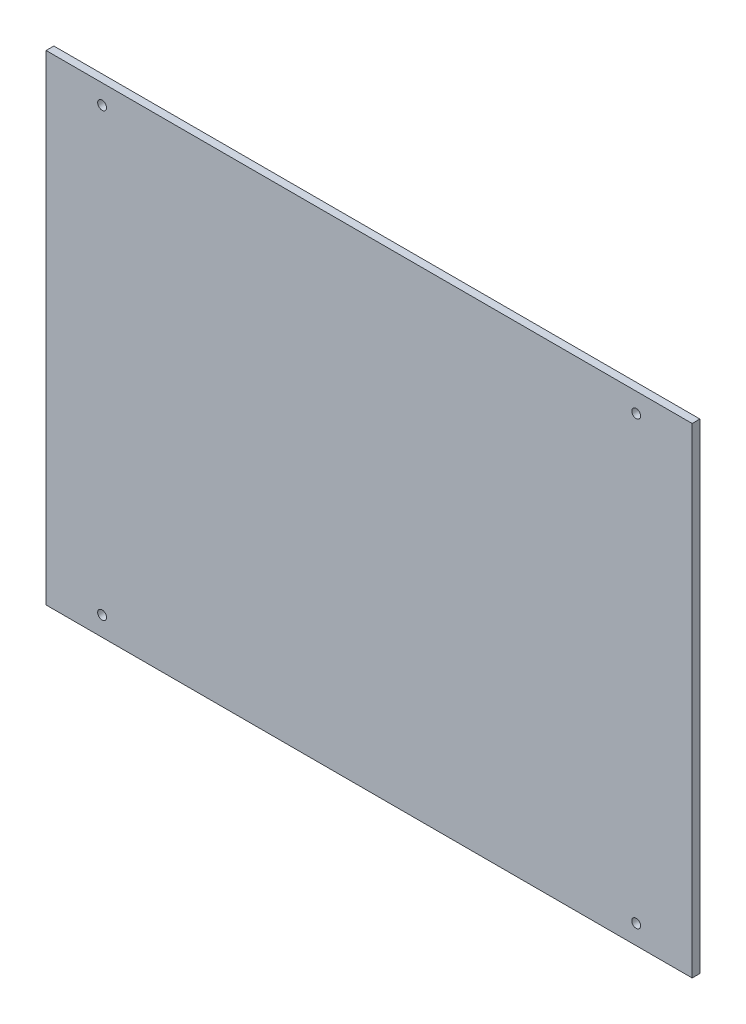
ISO-10303-21;
HEADER;
FILE_DESCRIPTION(('STEP AP214'),'2;1');
FILE_NAME('part.step','',(''),(''),'','','');
FILE_SCHEMA(('AUTOMOTIVE_DESIGN { 1 0 10303 214 1 1 1 1 }'));
ENDSEC;
DATA;
#1=APPLICATION_CONTEXT('core data for automotive mechanical design processes');
#2=APPLICATION_PROTOCOL_DEFINITION('international standard','automotive_design',2000,#1);
#3=PRODUCT_CONTEXT('',#1,'mechanical');
#4=PRODUCT('Part','Part','',(#3));
#5=PRODUCT_RELATED_PRODUCT_CATEGORY('part','',(#4));
#6=PRODUCT_DEFINITION_FORMATION('','',#4);
#7=PRODUCT_DEFINITION_CONTEXT('part definition',#1,'design');
#8=PRODUCT_DEFINITION('design','',#6,#7);
#9=PRODUCT_DEFINITION_SHAPE('','',#8);
#10=(LENGTH_UNIT() NAMED_UNIT(*) SI_UNIT(.MILLI.,.METRE.));
#11=(NAMED_UNIT(*) PLANE_ANGLE_UNIT() SI_UNIT($,.RADIAN.));
#12=(NAMED_UNIT(*) SI_UNIT($,.STERADIAN.) SOLID_ANGLE_UNIT());
#13=UNCERTAINTY_MEASURE_WITH_UNIT(LENGTH_MEASURE(1.E-05),#10,'distance_accuracy_value','');
#14=(GEOMETRIC_REPRESENTATION_CONTEXT(3) GLOBAL_UNCERTAINTY_ASSIGNED_CONTEXT((#13)) GLOBAL_UNIT_ASSIGNED_CONTEXT((#10,
#11,#12)) REPRESENTATION_CONTEXT('',''));
#15=CARTESIAN_POINT('',(0.,0.,0.));
#16=DIRECTION('',(0.,0.,1.));
#17=DIRECTION('',(1.,0.,0.));
#18=AXIS2_PLACEMENT_3D('',#15,#16,#17);
#19=CARTESIAN_POINT('',(-150.,-111.5,-3.6));
#20=DIRECTION('',(-1.,0.,0.));
#21=DIRECTION('',(0.,0.,1.));
#22=AXIS2_PLACEMENT_3D('',#19,#20,#21);
#23=PLANE('',#22);
#24=DIRECTION('',(0.,-1.,0.));
#25=VECTOR('',#24,1.);
#26=CARTESIAN_POINT('',(-150.,-111.5,0.));
#27=LINE('',#26,#25);
#28=CARTESIAN_POINT('',(-150.,111.5,0.));
#29=VERTEX_POINT('',#28);
#30=CARTESIAN_POINT('',(-150.,-111.5,0.));
#31=VERTEX_POINT('',#30);
#32=EDGE_CURVE('E102',#29,#31,#27,.T.);
#33=ORIENTED_EDGE('',*,*,#32,.F.);
#34=DIRECTION('',(0.,0.,1.));
#35=VECTOR('',#34,1.);
#36=CARTESIAN_POINT('',(-150.,111.5,-3.6));
#37=LINE('',#36,#35);
#38=CARTESIAN_POINT('',(-150.,111.5,-3.6));
#39=VERTEX_POINT('',#38);
#40=EDGE_CURVE('E11',#39,#29,#37,.T.);
#41=ORIENTED_EDGE('',*,*,#40,.F.);
#42=DIRECTION('',(0.,-1.,0.));
#43=VECTOR('',#42,1.);
#44=CARTESIAN_POINT('',(-150.,-111.5,-3.6));
#45=LINE('',#44,#43);
#46=CARTESIAN_POINT('',(-150.,-111.5,-3.6));
#47=VERTEX_POINT('',#46);
#48=EDGE_CURVE('E95',#39,#47,#45,.T.);
#49=ORIENTED_EDGE('',*,*,#48,.T.);
#50=DIRECTION('',(0.,0.,1.));
#51=VECTOR('',#50,1.);
#52=CARTESIAN_POINT('',(-150.,-111.5,-3.6));
#53=LINE('',#52,#51);
#54=EDGE_CURVE('E40',#47,#31,#53,.T.);
#55=ORIENTED_EDGE('',*,*,#54,.T.);
#56=EDGE_LOOP('',(#33,#41,#49,#55));
#57=FACE_BOUND('',#56,.T.);
#58=ADVANCED_FACE('F37',(#57),#23,.T.);
#59=CARTESIAN_POINT('',(150.,111.5,-3.6));
#60=DIRECTION('',(0.,1.,0.));
#61=DIRECTION('',(-1.,0.,0.));
#62=AXIS2_PLACEMENT_3D('',#59,#60,#61);
#63=PLANE('',#62);
#64=DIRECTION('',(-1.,0.,0.));
#65=VECTOR('',#64,1.);
#66=CARTESIAN_POINT('',(150.,111.5,0.));
#67=LINE('',#66,#65);
#68=CARTESIAN_POINT('',(150.,111.5,0.));
#69=VERTEX_POINT('',#68);
#70=EDGE_CURVE('E97',#69,#29,#67,.T.);
#71=ORIENTED_EDGE('',*,*,#70,.F.);
#72=DIRECTION('',(0.,0.,1.));
#73=VECTOR('',#72,1.);
#74=CARTESIAN_POINT('',(150.,111.5,-3.6));
#75=LINE('',#74,#73);
#76=CARTESIAN_POINT('',(150.,111.5,-3.6));
#77=VERTEX_POINT('',#76);
#78=EDGE_CURVE('E46',#77,#69,#75,.T.);
#79=ORIENTED_EDGE('',*,*,#78,.F.);
#80=DIRECTION('',(-1.,0.,0.));
#81=VECTOR('',#80,1.);
#82=CARTESIAN_POINT('',(150.,111.5,-3.6));
#83=LINE('',#82,#81);
#84=EDGE_CURVE('E92',#77,#39,#83,.T.);
#85=ORIENTED_EDGE('',*,*,#84,.T.);
#86=ORIENTED_EDGE('',*,*,#40,.T.);
#87=EDGE_LOOP('',(#71,#79,#85,#86));
#88=FACE_BOUND('',#87,.T.);
#89=ADVANCED_FACE('F113',(#88),#63,.T.);
#90=CARTESIAN_POINT('',(150.,-111.5,-3.6));
#91=DIRECTION('',(1.,0.,0.));
#92=DIRECTION('',(0.,1.,0.));
#93=AXIS2_PLACEMENT_3D('',#90,#91,#92);
#94=PLANE('',#93);
#95=DIRECTION('',(0.,1.,0.));
#96=VECTOR('',#95,1.);
#97=CARTESIAN_POINT('',(150.,-111.5,0.));
#98=LINE('',#97,#96);
#99=CARTESIAN_POINT('',(150.,-111.5,0.));
#100=VERTEX_POINT('',#99);
#101=EDGE_CURVE('E87',#100,#69,#98,.T.);
#102=ORIENTED_EDGE('',*,*,#101,.F.);
#103=DIRECTION('',(0.,0.,1.));
#104=VECTOR('',#103,1.);
#105=CARTESIAN_POINT('',(150.,-111.5,-3.6));
#106=LINE('',#105,#104);
#107=CARTESIAN_POINT('',(150.,-111.5,-3.6));
#108=VERTEX_POINT('',#107);
#109=EDGE_CURVE('E82',#108,#100,#106,.T.);
#110=ORIENTED_EDGE('',*,*,#109,.F.);
#111=DIRECTION('',(0.,1.,0.));
#112=VECTOR('',#111,1.);
#113=CARTESIAN_POINT('',(150.,-111.5,-3.6));
#114=LINE('',#113,#112);
#115=EDGE_CURVE('E85',#108,#77,#114,.T.);
#116=ORIENTED_EDGE('',*,*,#115,.T.);
#117=ORIENTED_EDGE('',*,*,#78,.T.);
#118=EDGE_LOOP('',(#102,#110,#116,#117));
#119=FACE_BOUND('',#118,.T.);
#120=ADVANCED_FACE('F84',(#119),#94,.T.);
#121=CARTESIAN_POINT('',(150.,-111.5,-3.6));
#122=DIRECTION('',(0.,-1.,0.));
#123=DIRECTION('',(1.,0.,0.));
#124=AXIS2_PLACEMENT_3D('',#121,#122,#123);
#125=PLANE('',#124);
#126=DIRECTION('',(1.,0.,0.));
#127=VECTOR('',#126,1.);
#128=CARTESIAN_POINT('',(150.,-111.5,0.));
#129=LINE('',#128,#127);
#130=EDGE_CURVE('E105',#31,#100,#129,.T.);
#131=ORIENTED_EDGE('',*,*,#130,.F.);
#132=ORIENTED_EDGE('',*,*,#54,.F.);
#133=DIRECTION('',(1.,0.,0.));
#134=VECTOR('',#133,1.);
#135=CARTESIAN_POINT('',(150.,-111.5,-3.6));
#136=LINE('',#135,#134);
#137=EDGE_CURVE('E91',#47,#108,#136,.T.);
#138=ORIENTED_EDGE('',*,*,#137,.T.);
#139=ORIENTED_EDGE('',*,*,#109,.T.);
#140=EDGE_LOOP('',(#131,#132,#138,#139));
#141=FACE_BOUND('',#140,.T.);
#142=ADVANCED_FACE('F94',(#141),#125,.T.);
#143=CARTESIAN_POINT('',(0.,0.,-3.6));
#144=DIRECTION('',(0.,0.,1.));
#145=DIRECTION('',(1.,0.,0.));
#146=AXIS2_PLACEMENT_3D('',#143,#144,#145);
#147=PLANE('',#146);
#148=CARTESIAN_POINT('',(124.,102.5,-3.6));
#149=DIRECTION('',(0.,0.,1.));
#150=DIRECTION('',(-1.,0.,0.));
#151=AXIS2_PLACEMENT_3D('',#148,#149,#150);
#152=CIRCLE('',#151,2.04999999999999);
#153=CARTESIAN_POINT('',(121.95,102.5,-3.6));
#154=VERTEX_POINT('',#153);
#155=EDGE_CURVE('E154',#154,#154,#152,.T.);
#156=ORIENTED_EDGE('',*,*,#155,.T.);
#157=EDGE_LOOP('',(#156));
#158=FACE_BOUND('',#157,.T.);
#159=CARTESIAN_POINT('',(124.,-102.5,-3.6));
#160=DIRECTION('',(0.,0.,1.));
#161=DIRECTION('',(1.,0.,0.));
#162=AXIS2_PLACEMENT_3D('',#159,#160,#161);
#163=CIRCLE('',#162,2.04999999999999);
#164=CARTESIAN_POINT('',(126.05,-102.5,-3.6));
#165=VERTEX_POINT('',#164);
#166=EDGE_CURVE('E162',#165,#165,#163,.T.);
#167=ORIENTED_EDGE('',*,*,#166,.T.);
#168=EDGE_LOOP('',(#167));
#169=FACE_BOUND('',#168,.T.);
#170=CARTESIAN_POINT('',(-124.,-102.5,-3.6));
#171=DIRECTION('',(0.,0.,1.));
#172=DIRECTION('',(-1.,0.,0.));
#173=AXIS2_PLACEMENT_3D('',#170,#171,#172);
#174=CIRCLE('',#173,2.04999999999999);
#175=CARTESIAN_POINT('',(-126.05,-102.5,-3.6));
#176=VERTEX_POINT('',#175);
#177=EDGE_CURVE('E168',#176,#176,#174,.T.);
#178=ORIENTED_EDGE('',*,*,#177,.T.);
#179=EDGE_LOOP('',(#178));
#180=FACE_BOUND('',#179,.T.);
#181=CARTESIAN_POINT('',(-124.,102.5,-3.6));
#182=DIRECTION('',(0.,0.,1.));
#183=DIRECTION('',(1.,0.,0.));
#184=AXIS2_PLACEMENT_3D('',#181,#182,#183);
#185=CIRCLE('',#184,2.04999999999999);
#186=CARTESIAN_POINT('',(-121.95,102.5,-3.6));
#187=VERTEX_POINT('',#186);
#188=EDGE_CURVE('E106',#187,#187,#185,.T.);
#189=ORIENTED_EDGE('',*,*,#188,.T.);
#190=EDGE_LOOP('',(#189));
#191=FACE_BOUND('',#190,.T.);
#192=ORIENTED_EDGE('',*,*,#48,.F.);
#193=ORIENTED_EDGE('',*,*,#84,.F.);
#194=ORIENTED_EDGE('',*,*,#115,.F.);
#195=ORIENTED_EDGE('',*,*,#137,.F.);
#196=EDGE_LOOP('',(#192,#193,#194,#195));
#197=FACE_BOUND('',#196,.T.);
#198=ADVANCED_FACE('F90',(#158,#169,#180,#191,#197),#147,.F.);
#199=CARTESIAN_POINT('',(0.,0.,0.));
#200=DIRECTION('',(0.,0.,1.));
#201=DIRECTION('',(1.,0.,0.));
#202=AXIS2_PLACEMENT_3D('',#199,#200,#201);
#203=PLANE('',#202);
#204=CARTESIAN_POINT('',(124.,102.5,0.));
#205=DIRECTION('',(0.,0.,1.));
#206=DIRECTION('',(-1.,0.,0.));
#207=AXIS2_PLACEMENT_3D('',#204,#205,#206);
#208=CIRCLE('',#207,2.04999999999999);
#209=CARTESIAN_POINT('',(121.95,102.5,0.));
#210=VERTEX_POINT('',#209);
#211=EDGE_CURVE('E157',#210,#210,#208,.T.);
#212=ORIENTED_EDGE('',*,*,#211,.F.);
#213=EDGE_LOOP('',(#212));
#214=FACE_BOUND('',#213,.T.);
#215=CARTESIAN_POINT('',(124.,-102.5,0.));
#216=DIRECTION('',(0.,0.,1.));
#217=DIRECTION('',(1.,0.,0.));
#218=AXIS2_PLACEMENT_3D('',#215,#216,#217);
#219=CIRCLE('',#218,2.04999999999999);
#220=CARTESIAN_POINT('',(126.05,-102.5,0.));
#221=VERTEX_POINT('',#220);
#222=EDGE_CURVE('E159',#221,#221,#219,.T.);
#223=ORIENTED_EDGE('',*,*,#222,.F.);
#224=EDGE_LOOP('',(#223));
#225=FACE_BOUND('',#224,.T.);
#226=CARTESIAN_POINT('',(-124.,-102.5,0.));
#227=DIRECTION('',(0.,0.,1.));
#228=DIRECTION('',(-1.,0.,0.));
#229=AXIS2_PLACEMENT_3D('',#226,#227,#228);
#230=CIRCLE('',#229,2.04999999999999);
#231=CARTESIAN_POINT('',(-126.05,-102.5,0.));
#232=VERTEX_POINT('',#231);
#233=EDGE_CURVE('E165',#232,#232,#230,.T.);
#234=ORIENTED_EDGE('',*,*,#233,.F.);
#235=EDGE_LOOP('',(#234));
#236=FACE_BOUND('',#235,.T.);
#237=CARTESIAN_POINT('',(-124.,102.5,0.));
#238=DIRECTION('',(0.,0.,1.));
#239=DIRECTION('',(1.,0.,0.));
#240=AXIS2_PLACEMENT_3D('',#237,#238,#239);
#241=CIRCLE('',#240,2.04999999999999);
#242=CARTESIAN_POINT('',(-121.95,102.5,0.));
#243=VERTEX_POINT('',#242);
#244=EDGE_CURVE('E171',#243,#243,#241,.T.);
#245=ORIENTED_EDGE('',*,*,#244,.F.);
#246=EDGE_LOOP('',(#245));
#247=FACE_BOUND('',#246,.T.);
#248=ORIENTED_EDGE('',*,*,#32,.T.);
#249=ORIENTED_EDGE('',*,*,#130,.T.);
#250=ORIENTED_EDGE('',*,*,#101,.T.);
#251=ORIENTED_EDGE('',*,*,#70,.T.);
#252=EDGE_LOOP('',(#248,#249,#250,#251));
#253=FACE_BOUND('',#252,.T.);
#254=ADVANCED_FACE('F112',(#214,#225,#236,#247,#253),#203,.T.);
#255=CARTESIAN_POINT('',(-124.,102.5,-3.6));
#256=DIRECTION('',(0.,0.,1.));
#257=DIRECTION('',(1.,0.,0.));
#258=AXIS2_PLACEMENT_3D('',#255,#256,#257);
#259=CYLINDRICAL_SURFACE('',#258,2.04999999999999);
#260=ORIENTED_EDGE('',*,*,#188,.F.);
#261=EDGE_LOOP('',(#260));
#262=FACE_BOUND('',#261,.T.);
#263=ORIENTED_EDGE('',*,*,#244,.T.);
#264=EDGE_LOOP('',(#263));
#265=FACE_BOUND('',#264,.T.);
#266=ADVANCED_FACE('F131',(#262,#265),#259,.F.);
#267=CARTESIAN_POINT('',(-124.,-102.5,-3.6));
#268=DIRECTION('',(0.,0.,1.));
#269=DIRECTION('',(1.,0.,0.));
#270=AXIS2_PLACEMENT_3D('',#267,#268,#269);
#271=CYLINDRICAL_SURFACE('',#270,2.04999999999999);
#272=ORIENTED_EDGE('',*,*,#177,.F.);
#273=EDGE_LOOP('',(#272));
#274=FACE_BOUND('',#273,.T.);
#275=ORIENTED_EDGE('',*,*,#233,.T.);
#276=EDGE_LOOP('',(#275));
#277=FACE_BOUND('',#276,.T.);
#278=ADVANCED_FACE('F138',(#274,#277),#271,.F.);
#279=CARTESIAN_POINT('',(124.,-102.5,-3.6));
#280=DIRECTION('',(0.,0.,1.));
#281=DIRECTION('',(1.,0.,0.));
#282=AXIS2_PLACEMENT_3D('',#279,#280,#281);
#283=CYLINDRICAL_SURFACE('',#282,2.04999999999999);
#284=ORIENTED_EDGE('',*,*,#166,.F.);
#285=EDGE_LOOP('',(#284));
#286=FACE_BOUND('',#285,.T.);
#287=ORIENTED_EDGE('',*,*,#222,.T.);
#288=EDGE_LOOP('',(#287));
#289=FACE_BOUND('',#288,.T.);
#290=ADVANCED_FACE('F142',(#286,#289),#283,.F.);
#291=CARTESIAN_POINT('',(124.,102.5,-3.6));
#292=DIRECTION('',(0.,0.,1.));
#293=DIRECTION('',(1.,0.,0.));
#294=AXIS2_PLACEMENT_3D('',#291,#292,#293);
#295=CYLINDRICAL_SURFACE('',#294,2.04999999999999);
#296=ORIENTED_EDGE('',*,*,#155,.F.);
#297=EDGE_LOOP('',(#296));
#298=FACE_BOUND('',#297,.T.);
#299=ORIENTED_EDGE('',*,*,#211,.T.);
#300=EDGE_LOOP('',(#299));
#301=FACE_BOUND('',#300,.T.);
#302=ADVANCED_FACE('F146',(#298,#301),#295,.F.);
#303=CLOSED_SHELL('',(#58,#89,#120,#142,#198,#254,#266,#278,#290,#302));
#304=MANIFOLD_SOLID_BREP('B2',#303);
#305=ADVANCED_BREP_SHAPE_REPRESENTATION('',(#18,#304),#14);
#306=SHAPE_DEFINITION_REPRESENTATION(#9,#305);
ENDSEC;
END-ISO-10303-21;
